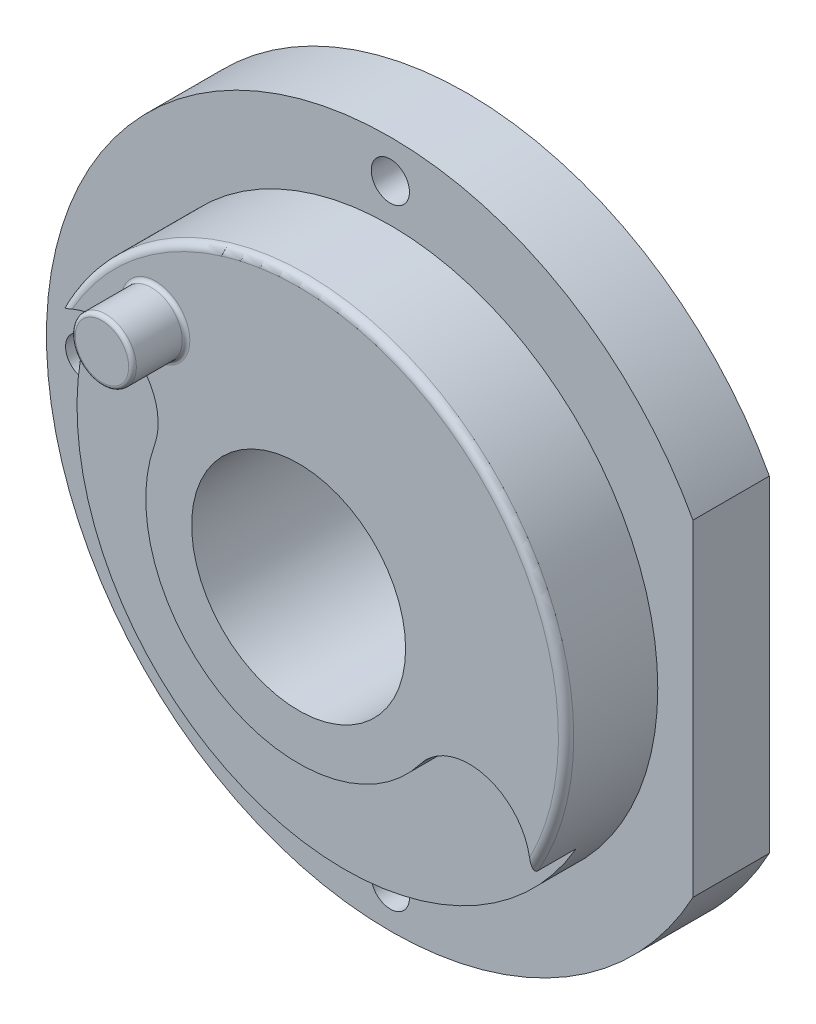
ISO-10303-21;
HEADER;
FILE_DESCRIPTION(('STEP AP214'),'2;1');
FILE_NAME('part.step','',(''),(''),'','','');
FILE_SCHEMA(('AUTOMOTIVE_DESIGN { 1 0 10303 214 1 1 1 1 }'));
ENDSEC;
DATA;
#1=APPLICATION_CONTEXT('core data for automotive mechanical design processes');
#2=APPLICATION_PROTOCOL_DEFINITION('international standard','automotive_design',2000,#1);
#3=PRODUCT_CONTEXT('',#1,'mechanical');
#4=PRODUCT('Part','Part','',(#3));
#5=PRODUCT_RELATED_PRODUCT_CATEGORY('part','',(#4));
#6=PRODUCT_DEFINITION_FORMATION('','',#4);
#7=PRODUCT_DEFINITION_CONTEXT('part definition',#1,'design');
#8=PRODUCT_DEFINITION('design','',#6,#7);
#9=PRODUCT_DEFINITION_SHAPE('','',#8);
#10=(LENGTH_UNIT() NAMED_UNIT(*) SI_UNIT(.MILLI.,.METRE.));
#11=(NAMED_UNIT(*) PLANE_ANGLE_UNIT() SI_UNIT($,.RADIAN.));
#12=(NAMED_UNIT(*) SI_UNIT($,.STERADIAN.) SOLID_ANGLE_UNIT());
#13=UNCERTAINTY_MEASURE_WITH_UNIT(LENGTH_MEASURE(1.E-05),#10,'distance_accuracy_value','');
#14=(GEOMETRIC_REPRESENTATION_CONTEXT(3) GLOBAL_UNCERTAINTY_ASSIGNED_CONTEXT((#13)) GLOBAL_UNIT_ASSIGNED_CONTEXT((#10,
#11,#12)) REPRESENTATION_CONTEXT('',''));
#15=CARTESIAN_POINT('',(0.,0.,0.));
#16=DIRECTION('',(0.,0.,1.));
#17=DIRECTION('',(1.,0.,0.));
#18=AXIS2_PLACEMENT_3D('',#15,#16,#17);
#19=CARTESIAN_POINT('',(0.,0.,5.));
#20=DIRECTION('',(0.,0.,1.));
#21=DIRECTION('',(1.,0.,0.));
#22=AXIS2_PLACEMENT_3D('',#19,#20,#21);
#23=PLANE('',#22);
#24=DIRECTION('',(0.,-1.,0.));
#25=VECTOR('',#24,1.);
#26=CARTESIAN_POINT('',(19.8,-17.9414071691897,5.));
#27=LINE('',#26,#25);
#28=CARTESIAN_POINT('',(19.8,10.6869078783341,5.));
#29=VERTEX_POINT('',#28);
#30=CARTESIAN_POINT('',(19.8,-10.6869078783341,5.));
#31=VERTEX_POINT('',#30);
#32=EDGE_CURVE('E58',#29,#31,#27,.T.);
#33=ORIENTED_EDGE('',*,*,#32,.F.);
#34=CARTESIAN_POINT('',(0.,0.,5.));
#35=DIRECTION('',(0.,0.,1.));
#36=DIRECTION('',(1.,0.,0.));
#37=AXIS2_PLACEMENT_3D('',#34,#35,#36);
#38=CIRCLE('',#37,22.5);
#39=EDGE_CURVE('E110',#29,#31,#38,.T.);
#40=ORIENTED_EDGE('',*,*,#39,.T.);
#41=EDGE_LOOP('',(#33,#40));
#42=FACE_BOUND('',#41,.T.);
#43=CARTESIAN_POINT('',(0.,0.,5.));
#44=DIRECTION('',(0.,0.,1.));
#45=DIRECTION('',(1.,0.,0.));
#46=AXIS2_PLACEMENT_3D('',#43,#44,#45);
#47=CIRCLE('',#46,17.5);
#48=CARTESIAN_POINT('',(17.5,0.,5.));
#49=VERTEX_POINT('',#48);
#50=EDGE_CURVE('E371',#49,#49,#47,.T.);
#51=ORIENTED_EDGE('',*,*,#50,.F.);
#52=EDGE_LOOP('',(#51));
#53=FACE_BOUND('',#52,.T.);
#54=CARTESIAN_POINT('',(0.,-20.,5.));
#55=DIRECTION('',(0.,0.,1.));
#56=DIRECTION('',(1.,0.,0.));
#57=AXIS2_PLACEMENT_3D('',#54,#55,#56);
#58=CIRCLE('',#57,1.25);
#59=CARTESIAN_POINT('',(1.25,-20.,5.));
#60=VERTEX_POINT('',#59);
#61=EDGE_CURVE('E381',#60,#60,#58,.T.);
#62=ORIENTED_EDGE('',*,*,#61,.F.);
#63=EDGE_LOOP('',(#62));
#64=FACE_BOUND('',#63,.T.);
#65=CARTESIAN_POINT('',(0.,20.,5.));
#66=DIRECTION('',(0.,0.,1.));
#67=DIRECTION('',(1.,0.,0.));
#68=AXIS2_PLACEMENT_3D('',#65,#66,#67);
#69=CIRCLE('',#68,1.25);
#70=CARTESIAN_POINT('',(1.25,20.,5.));
#71=VERTEX_POINT('',#70);
#72=EDGE_CURVE('E119',#71,#71,#69,.T.);
#73=ORIENTED_EDGE('',*,*,#72,.F.);
#74=EDGE_LOOP('',(#73));
#75=FACE_BOUND('',#74,.T.);
#76=CARTESIAN_POINT('',(-20.,0.,5.));
#77=DIRECTION('',(0.,0.,1.));
#78=DIRECTION('',(1.,0.,0.));
#79=AXIS2_PLACEMENT_3D('',#76,#77,#78);
#80=CIRCLE('',#79,1.25);
#81=CARTESIAN_POINT('',(-18.75,0.,5.));
#82=VERTEX_POINT('',#81);
#83=EDGE_CURVE('E375',#82,#82,#80,.T.);
#84=ORIENTED_EDGE('',*,*,#83,.F.);
#85=EDGE_LOOP('',(#84));
#86=FACE_BOUND('',#85,.T.);
#87=ADVANCED_FACE('F43',(#42,#53,#64,#75,#86),#23,.T.);
#88=CARTESIAN_POINT('',(0.,0.,0.));
#89=DIRECTION('',(0.,0.,1.));
#90=DIRECTION('',(1.,0.,0.));
#91=AXIS2_PLACEMENT_3D('',#88,#89,#90);
#92=PLANE('',#91);
#93=CARTESIAN_POINT('',(0.,0.,0.));
#94=DIRECTION('',(0.,0.,1.));
#95=DIRECTION('',(1.,0.,0.));
#96=AXIS2_PLACEMENT_3D('',#93,#94,#95);
#97=CIRCLE('',#96,7.);
#98=CARTESIAN_POINT('',(7.,0.,0.));
#99=VERTEX_POINT('',#98);
#100=EDGE_CURVE('E359',#99,#99,#97,.T.);
#101=ORIENTED_EDGE('',*,*,#100,.T.);
#102=EDGE_LOOP('',(#101));
#103=FACE_BOUND('',#102,.T.);
#104=CARTESIAN_POINT('',(0.,0.,0.));
#105=DIRECTION('',(0.,0.,1.));
#106=DIRECTION('',(1.,0.,0.));
#107=AXIS2_PLACEMENT_3D('',#104,#105,#106);
#108=CIRCLE('',#107,22.5);
#109=CARTESIAN_POINT('',(19.8,10.6869078783341,0.));
#110=VERTEX_POINT('',#109);
#111=CARTESIAN_POINT('',(19.8,-10.6869078783341,0.));
#112=VERTEX_POINT('',#111);
#113=EDGE_CURVE('E114',#110,#112,#108,.T.);
#114=ORIENTED_EDGE('',*,*,#113,.F.);
#115=DIRECTION('',(0.,-1.,0.));
#116=VECTOR('',#115,1.);
#117=CARTESIAN_POINT('',(19.8,0.,0.));
#118=LINE('',#117,#116);
#119=EDGE_CURVE('E102',#110,#112,#118,.T.);
#120=ORIENTED_EDGE('',*,*,#119,.T.);
#121=EDGE_LOOP('',(#114,#120));
#122=FACE_BOUND('',#121,.T.);
#123=CARTESIAN_POINT('',(0.,20.,0.));
#124=DIRECTION('',(0.,0.,1.));
#125=DIRECTION('',(1.,0.,0.));
#126=AXIS2_PLACEMENT_3D('',#123,#124,#125);
#127=CIRCLE('',#126,1.25);
#128=CARTESIAN_POINT('',(1.25,20.,0.));
#129=VERTEX_POINT('',#128);
#130=EDGE_CURVE('E122',#129,#129,#127,.T.);
#131=ORIENTED_EDGE('',*,*,#130,.T.);
#132=EDGE_LOOP('',(#131));
#133=FACE_BOUND('',#132,.T.);
#134=CARTESIAN_POINT('',(0.,-20.,0.));
#135=DIRECTION('',(0.,0.,1.));
#136=DIRECTION('',(1.,0.,0.));
#137=AXIS2_PLACEMENT_3D('',#134,#135,#136);
#138=CIRCLE('',#137,1.25);
#139=CARTESIAN_POINT('',(1.25,-20.,0.));
#140=VERTEX_POINT('',#139);
#141=EDGE_CURVE('E378',#140,#140,#138,.T.);
#142=ORIENTED_EDGE('',*,*,#141,.T.);
#143=EDGE_LOOP('',(#142));
#144=FACE_BOUND('',#143,.T.);
#145=CARTESIAN_POINT('',(-20.,0.,0.));
#146=DIRECTION('',(0.,0.,1.));
#147=DIRECTION('',(1.,0.,0.));
#148=AXIS2_PLACEMENT_3D('',#145,#146,#147);
#149=CIRCLE('',#148,1.25);
#150=CARTESIAN_POINT('',(-18.75,0.,0.));
#151=VERTEX_POINT('',#150);
#152=EDGE_CURVE('E374',#151,#151,#149,.T.);
#153=ORIENTED_EDGE('',*,*,#152,.T.);
#154=EDGE_LOOP('',(#153));
#155=FACE_BOUND('',#154,.T.);
#156=ADVANCED_FACE('F199',(#103,#122,#133,#144,#155),#92,.F.);
#157=CARTESIAN_POINT('',(0.,0.,5.));
#158=DIRECTION('',(0.,0.,-1.));
#159=DIRECTION('',(-1.,0.,0.));
#160=AXIS2_PLACEMENT_3D('',#157,#158,#159);
#161=CYLINDRICAL_SURFACE('',#160,22.5);
#162=ORIENTED_EDGE('',*,*,#39,.F.);
#163=DIRECTION('',(0.,0.,-1.));
#164=VECTOR('',#163,1.);
#165=CARTESIAN_POINT('',(19.8,10.6869078783341,5.));
#166=LINE('',#165,#164);
#167=EDGE_CURVE('E11',#29,#110,#166,.T.);
#168=ORIENTED_EDGE('',*,*,#167,.T.);
#169=ORIENTED_EDGE('',*,*,#113,.T.);
#170=DIRECTION('',(0.,0.,-1.));
#171=VECTOR('',#170,1.);
#172=CARTESIAN_POINT('',(19.8,-10.6869078783341,5.));
#173=LINE('',#172,#171);
#174=EDGE_CURVE('E51',#112,#31,#173,.F.);
#175=ORIENTED_EDGE('',*,*,#174,.T.);
#176=EDGE_LOOP('',(#162,#168,#169,#175));
#177=FACE_BOUND('',#176,.T.);
#178=ADVANCED_FACE('F112',(#177),#161,.T.);
#179=CARTESIAN_POINT('',(0.,20.,5.));
#180=DIRECTION('',(0.,0.,-1.));
#181=DIRECTION('',(-1.,0.,0.));
#182=AXIS2_PLACEMENT_3D('',#179,#180,#181);
#183=CYLINDRICAL_SURFACE('',#182,1.25);
#184=ORIENTED_EDGE('',*,*,#72,.T.);
#185=EDGE_LOOP('',(#184));
#186=FACE_BOUND('',#185,.T.);
#187=ORIENTED_EDGE('',*,*,#130,.F.);
#188=EDGE_LOOP('',(#187));
#189=FACE_BOUND('',#188,.T.);
#190=ADVANCED_FACE('F192',(#186,#189),#183,.F.);
#191=CARTESIAN_POINT('',(0.,-20.,5.));
#192=DIRECTION('',(0.,0.,-1.));
#193=DIRECTION('',(-1.,0.,0.));
#194=AXIS2_PLACEMENT_3D('',#191,#192,#193);
#195=CYLINDRICAL_SURFACE('',#194,1.25);
#196=ORIENTED_EDGE('',*,*,#61,.T.);
#197=EDGE_LOOP('',(#196));
#198=FACE_BOUND('',#197,.T.);
#199=ORIENTED_EDGE('',*,*,#141,.F.);
#200=EDGE_LOOP('',(#199));
#201=FACE_BOUND('',#200,.T.);
#202=ADVANCED_FACE('F188',(#198,#201),#195,.F.);
#203=CARTESIAN_POINT('',(-20.,0.,5.));
#204=DIRECTION('',(0.,0.,-1.));
#205=DIRECTION('',(-1.,0.,0.));
#206=AXIS2_PLACEMENT_3D('',#203,#204,#205);
#207=CYLINDRICAL_SURFACE('',#206,1.25);
#208=ORIENTED_EDGE('',*,*,#83,.T.);
#209=EDGE_LOOP('',(#208));
#210=FACE_BOUND('',#209,.T.);
#211=ORIENTED_EDGE('',*,*,#152,.F.);
#212=EDGE_LOOP('',(#211));
#213=FACE_BOUND('',#212,.T.);
#214=ADVANCED_FACE('F184',(#210,#213),#207,.F.);
#215=CARTESIAN_POINT('',(0.,0.,11.));
#216=DIRECTION('',(0.,0.,-1.));
#217=DIRECTION('',(-1.,0.,0.));
#218=AXIS2_PLACEMENT_3D('',#215,#216,#217);
#219=CYLINDRICAL_SURFACE('',#218,17.5);
#220=CARTESIAN_POINT('',(0.,0.,8.));
#221=DIRECTION('',(0.,0.,1.));
#222=DIRECTION('',(1.,0.,0.));
#223=AXIS2_PLACEMENT_3D('',#220,#221,#222);
#224=CIRCLE('',#223,17.5);
#225=CARTESIAN_POINT('',(-15.6420504470762,7.84705408488593,8.));
#226=VERTEX_POINT('',#225);
#227=CARTESIAN_POINT('',(15.1549923195811,-8.75078326742467,8.));
#228=VERTEX_POINT('',#227);
#229=EDGE_CURVE('E344',#226,#228,#224,.T.);
#230=ORIENTED_EDGE('',*,*,#229,.F.);
#231=DIRECTION('',(0.,0.,1.));
#232=VECTOR('',#231,1.);
#233=CARTESIAN_POINT('',(-15.6420504470762,7.84705408488592,9.5));
#234=LINE('',#233,#232);
#235=CARTESIAN_POINT('',(-15.6420504470762,7.84705408488594,10.5000000000009));
#236=VERTEX_POINT('',#235);
#237=EDGE_CURVE('E369',#226,#236,#234,.T.);
#238=ORIENTED_EDGE('',*,*,#237,.T.);
#239=CARTESIAN_POINT('',(0.,0.,10.5));
#240=DIRECTION('',(0.,0.,1.));
#241=DIRECTION('',(1.,0.,0.));
#242=AXIS2_PLACEMENT_3D('',#239,#240,#241);
#243=CIRCLE('',#242,17.5);
#244=CARTESIAN_POINT('',(15.1549923195811,-8.75078326742466,10.5));
#245=VERTEX_POINT('',#244);
#246=EDGE_CURVE('E117',#236,#245,#243,.F.);
#247=ORIENTED_EDGE('',*,*,#246,.T.);
#248=DIRECTION('',(0.,0.,1.));
#249=VECTOR('',#248,1.);
#250=CARTESIAN_POINT('',(15.1549923195811,-8.75078326742468,9.5));
#251=LINE('',#250,#249);
#252=EDGE_CURVE('E66',#245,#228,#251,.F.);
#253=ORIENTED_EDGE('',*,*,#252,.T.);
#254=EDGE_LOOP('',(#230,#238,#247,#253));
#255=FACE_BOUND('',#254,.T.);
#256=ORIENTED_EDGE('',*,*,#50,.T.);
#257=EDGE_LOOP('',(#256));
#258=FACE_BOUND('',#257,.T.);
#259=ADVANCED_FACE('F180',(#255,#258),#219,.T.);
#260=CARTESIAN_POINT('',(0.,0.,11.));
#261=DIRECTION('',(0.,0.,1.));
#262=DIRECTION('',(1.,0.,0.));
#263=AXIS2_PLACEMENT_3D('',#260,#261,#262);
#264=PLANE('',#263);
#265=CARTESIAN_POINT('',(0.,0.,11.));
#266=DIRECTION('',(0.,0.,1.));
#267=DIRECTION('',(1.,0.,0.));
#268=AXIS2_PLACEMENT_3D('',#265,#266,#267);
#269=CIRCLE('',#268,7.);
#270=CARTESIAN_POINT('',(7.,0.,11.));
#271=VERTEX_POINT('',#270);
#272=EDGE_CURVE('E413',#271,#271,#269,.T.);
#273=ORIENTED_EDGE('',*,*,#272,.F.);
#274=EDGE_LOOP('',(#273));
#275=FACE_BOUND('',#274,.T.);
#276=CARTESIAN_POINT('',(-13.1930422619878,4.68440347039018,11.));
#277=DIRECTION('',(0.,0.,1.));
#278=DIRECTION('',(1.,0.,0.));
#279=AXIS2_PLACEMENT_3D('',#276,#277,#278);
#280=CIRCLE('',#279,4.);
#281=CARTESIAN_POINT('',(-9.42360161570558,3.34600247885013,11.));
#282=VERTEX_POINT('',#281);
#283=CARTESIAN_POINT('',(-14.8126068155352,8.34186306099305,11.));
#284=VERTEX_POINT('',#283);
#285=EDGE_CURVE('E350',#282,#284,#280,.T.);
#286=ORIENTED_EDGE('',*,*,#285,.F.);
#287=CARTESIAN_POINT('',(0.,0.,11.));
#288=DIRECTION('',(0.,0.,-1.));
#289=DIRECTION('',(1.,0.,0.));
#290=AXIS2_PLACEMENT_3D('',#287,#288,#289);
#291=CIRCLE('',#290,10.);
#292=CARTESIAN_POINT('',(7.97625995299374,-6.03152361864466,11.));
#293=VERTEX_POINT('',#292);
#294=EDGE_CURVE('E353',#293,#282,#291,.T.);
#295=ORIENTED_EDGE('',*,*,#294,.F.);
#296=CARTESIAN_POINT('',(11.1667639341912,-8.44413306610253,11.));
#297=DIRECTION('',(0.,0.,1.));
#298=DIRECTION('',(1.,0.,0.));
#299=AXIS2_PLACEMENT_3D('',#296,#297,#298);
#300=CIRCLE('',#299,4.);
#301=CARTESIAN_POINT('',(15.1122347108096,-7.78590791400737,11.));
#302=VERTEX_POINT('',#301);
#303=EDGE_CURVE('E351',#302,#293,#300,.T.);
#304=ORIENTED_EDGE('',*,*,#303,.F.);
#305=CARTESIAN_POINT('',(0.,0.,11.));
#306=DIRECTION('',(0.,0.,1.));
#307=DIRECTION('',(1.,0.,0.));
#308=AXIS2_PLACEMENT_3D('',#305,#306,#307);
#309=CIRCLE('',#308,17.);
#310=EDGE_CURVE('E113',#302,#284,#309,.T.);
#311=ORIENTED_EDGE('',*,*,#310,.T.);
#312=EDGE_LOOP('',(#286,#295,#304,#311));
#313=FACE_BOUND('',#312,.T.);
#314=CARTESIAN_POINT('',(-9.367828489024,10.4040275566835,11.));
#315=DIRECTION('',(0.,0.,1.));
#316=DIRECTION('',(1.,0.,0.));
#317=AXIS2_PLACEMENT_3D('',#314,#315,#316);
#318=CIRCLE('',#317,2.25);
#319=CARTESIAN_POINT('',(-7.117828489024,10.4040275566835,11.));
#320=VERTEX_POINT('',#319);
#321=EDGE_CURVE('E133',#320,#320,#318,.F.);
#322=ORIENTED_EDGE('',*,*,#321,.T.);
#323=EDGE_LOOP('',(#322));
#324=FACE_BOUND('',#323,.T.);
#325=ADVANCED_FACE('F176',(#275,#313,#324),#264,.T.);
#326=CARTESIAN_POINT('',(-9.367828489024,10.4040275566835,14.5));
#327=DIRECTION('',(0.,0.,-1.));
#328=DIRECTION('',(-1.,0.,0.));
#329=AXIS2_PLACEMENT_3D('',#326,#327,#328);
#330=CYLINDRICAL_SURFACE('',#329,2.);
#331=CARTESIAN_POINT('',(-9.367828489024,10.4040275566835,11.25));
#332=DIRECTION('',(0.,0.,1.));
#333=DIRECTION('',(1.,0.,0.));
#334=AXIS2_PLACEMENT_3D('',#331,#332,#333);
#335=CIRCLE('',#334,2.);
#336=CARTESIAN_POINT('',(-7.367828489024,10.4040275566835,11.25));
#337=VERTEX_POINT('',#336);
#338=EDGE_CURVE('E130',#337,#337,#335,.T.);
#339=ORIENTED_EDGE('',*,*,#338,.T.);
#340=EDGE_LOOP('',(#339));
#341=FACE_BOUND('',#340,.T.);
#342=CARTESIAN_POINT('',(-9.367828489024,10.4040275566835,14.25));
#343=DIRECTION('',(0.,0.,1.));
#344=DIRECTION('',(1.,0.,0.));
#345=AXIS2_PLACEMENT_3D('',#342,#343,#344);
#346=CIRCLE('',#345,2.);
#347=CARTESIAN_POINT('',(-7.367828489024,10.4040275566835,14.25));
#348=VERTEX_POINT('',#347);
#349=EDGE_CURVE('E127',#348,#348,#346,.F.);
#350=ORIENTED_EDGE('',*,*,#349,.T.);
#351=EDGE_LOOP('',(#350));
#352=FACE_BOUND('',#351,.T.);
#353=ADVANCED_FACE('F172',(#341,#352),#330,.T.);
#354=CARTESIAN_POINT('',(-9.367828489024,10.4040275566835,14.5));
#355=DIRECTION('',(0.,0.,1.));
#356=DIRECTION('',(1.,0.,0.));
#357=AXIS2_PLACEMENT_3D('',#354,#355,#356);
#358=PLANE('',#357);
#359=CARTESIAN_POINT('',(-9.367828489024,10.4040275566835,14.5));
#360=DIRECTION('',(0.,0.,1.));
#361=DIRECTION('',(1.,0.,0.));
#362=AXIS2_PLACEMENT_3D('',#359,#360,#361);
#363=CIRCLE('',#362,1.75);
#364=CARTESIAN_POINT('',(-7.617828489024,10.4040275566835,14.5));
#365=VERTEX_POINT('',#364);
#366=EDGE_CURVE('E136',#365,#365,#363,.T.);
#367=ORIENTED_EDGE('',*,*,#366,.T.);
#368=EDGE_LOOP('',(#367));
#369=FACE_BOUND('',#368,.T.);
#370=ADVANCED_FACE('F169',(#369),#358,.T.);
#371=CARTESIAN_POINT('',(0.,0.,10.5));
#372=DIRECTION('',(0.,0.,1.));
#373=DIRECTION('',(1.,0.,0.));
#374=AXIS2_PLACEMENT_3D('',#371,#372,#373);
#375=TOROIDAL_SURFACE('',#374,17.,0.5);
#376=CARTESIAN_POINT('',(-14.0925554842546,8.58195089960348,10.4998));
#377=CARTESIAN_POINT('',(-14.0924954054147,8.58195890672162,10.5221016836643));
#378=CARTESIAN_POINT('',(-14.0945603759896,8.58148831247698,10.5443581106371));
#379=CARTESIAN_POINT('',(-14.1025345979372,8.57963798600353,10.5879636089799));
#380=CARTESIAN_POINT('',(-14.1084143740486,8.57826522337488,10.6093183111679));
#381=CARTESIAN_POINT('',(-14.1236070048994,8.57466126596326,10.65062005845));
#382=CARTESIAN_POINT('',(-14.1329125698104,8.57243189354615,10.6705699861917));
#383=CARTESIAN_POINT('',(-14.1544039544479,8.56717403516507,10.7087613957006));
#384=CARTESIAN_POINT('',(-14.1665951669323,8.56414405175444,10.7269995883281));
#385=CARTESIAN_POINT('',(-14.1980966929068,8.55612312486784,10.7677610060254));
#386=CARTESIAN_POINT('',(-14.2183897756552,8.55081893838281,10.789462501406));
#387=CARTESIAN_POINT('',(-14.2619723270169,8.53899839198793,10.8292055885751));
#388=CARTESIAN_POINT('',(-14.2852671054368,8.53247987467245,10.84724054516));
#389=CARTESIAN_POINT('',(-14.3438891877824,8.51543719811897,10.8865601989914));
#390=CARTESIAN_POINT('',(-14.3802149681455,8.50437010499717,10.9061147312752));
#391=CARTESIAN_POINT('',(-14.4549126003551,8.48035360309176,10.9391078917499));
#392=CARTESIAN_POINT('',(-14.4932873237058,8.46740150625872,10.9525376709444));
#393=CARTESIAN_POINT('',(-14.5894570539597,8.4332311650458,10.9792923134893));
#394=CARTESIAN_POINT('',(-14.6477652323556,8.41102145761363,10.9894972527948));
#395=CARTESIAN_POINT('',(-14.7640559652629,8.36352095122454,11.0005304652116));
#396=CARTESIAN_POINT('',(-14.8220369149504,8.3382206648887,11.0013290931301));
#397=CARTESIAN_POINT('',(-14.9536990871508,8.27700679749828,10.9939416701968));
#398=CARTESIAN_POINT('',(-15.0268241308473,8.24019780297734,10.9829647273049));
#399=CARTESIAN_POINT('',(-15.1328059834076,8.18282359179748,10.9573275750585));
#400=CARTESIAN_POINT('',(-15.1674755331101,8.16336383011166,10.947271101555));
#401=CARTESIAN_POINT('',(-15.2354265017855,8.12390949394304,10.9240302343841));
#402=CARTESIAN_POINT('',(-15.2687089646543,8.10391534093849,10.910848244795));
#403=CARTESIAN_POINT('',(-15.326023590079,8.06837302024599,10.8845785538095));
#404=CARTESIAN_POINT('',(-15.3504051067503,8.05287369551752,10.8721836446353));
#405=CARTESIAN_POINT('',(-15.3980402894818,8.02188639300569,10.8451255616875));
#406=CARTESIAN_POINT('',(-15.4212900507165,8.0063986142266,10.830455177971));
#407=CARTESIAN_POINT('',(-15.4719889025704,7.97188987430223,10.7944163417475));
#408=CARTESIAN_POINT('',(-15.4989855173005,7.95298159901716,10.7722950267687));
#409=CARTESIAN_POINT('',(-15.5490840398269,7.91704798570156,10.7226857159664));
#410=CARTESIAN_POINT('',(-15.5722105119845,7.90001102765007,10.6952341602495));
#411=CARTESIAN_POINT('',(-15.5991699213199,7.8798133603306,10.6522370126428));
#412=CARTESIAN_POINT('',(-15.6061467488276,7.87454292602374,10.6396912902777));
#413=CARTESIAN_POINT('',(-15.6185725441243,7.86510490048936,10.6135321935004));
#414=CARTESIAN_POINT('',(-15.6240285725322,7.86093221797937,10.5999241415989));
#415=CARTESIAN_POINT('',(-15.6328005738064,7.85420016935077,10.5722619055272));
#416=CARTESIAN_POINT('',(-15.636193768152,7.85158268482115,10.5582476546413));
#417=CARTESIAN_POINT('',(-15.6408615552638,7.84797496104798,10.5294536697967));
#418=CARTESIAN_POINT('',(-15.6421026110678,7.84701048339867,10.5146654551682));
#419=CARTESIAN_POINT('',(-15.6420503738977,7.84705414155187,10.4998));
#420=B_SPLINE_CURVE_WITH_KNOTS('',3,(#376,#377,#378,#379,#380,#381,#382,#383,#384,#385,#386,
#387,#388,#389,#390,#391,#392,#393,#394,#395,#396,#397,#398,#399,#400,#401,#402,#403,#404,#405,
#406,#407,#408,#409,#410,#411,#412,#413,#414,#415,#416,#417,#418,#419),.UNSPECIFIED.,.F.,.F.,(4,
2,2,2,2,2,2,2,2,2,2,2,2,2,2,2,2,2,2,2,2,4),(0.,0.0667299356915614,0.132950322840486,
0.199030604741618,0.265235367670183,0.355278870585104,0.445483899295609,0.572913410305842,
0.700526451736312,0.889151190584204,1.07837024591992,1.32482701157969,1.44775530274643,
1.57058934516832,1.66482084436369,1.75935726094649,1.87814165392613,1.99614088585408,
2.04190009722883,2.08744318260136,2.13115521090478,2.17554248395824),.UNSPECIFIED.);
#421=EDGE_CURVE('E147',#284,#236,#420,.T.);
#422=ORIENTED_EDGE('',*,*,#421,.F.);
#423=ORIENTED_EDGE('',*,*,#310,.F.);
#424=CARTESIAN_POINT('',(15.1549923266764,-8.75078317514375,10.4998));
#425=CARTESIAN_POINT('',(15.1549864480263,-8.75083501748741,10.5133418363376));
#426=CARTESIAN_POINT('',(15.1550879583852,-8.7495407208026,10.5268307305674));
#427=CARTESIAN_POINT('',(15.1554618273514,-8.74463073573373,10.5532035186283));
#428=CARTESIAN_POINT('',(15.1557319505222,-8.74104540690169,10.5660929938129));
#429=CARTESIAN_POINT('',(15.1564919222999,-8.73066793294204,10.5945341956772));
#430=CARTESIAN_POINT('',(15.157021505383,-8.72326958529509,10.6098591804471));
#431=CARTESIAN_POINT('',(15.1581844734355,-8.70611996400087,10.6391910184899));
#432=CARTESIAN_POINT('',(15.1588184345381,-8.6963554803261,10.653189835018));
#433=CARTESIAN_POINT('',(15.1605366922394,-8.6679481599043,10.6889623904212));
#434=CARTESIAN_POINT('',(15.161633013222,-8.64779448939199,10.7095210525954));
#435=CARTESIAN_POINT('',(15.1635940988126,-8.60481107511498,10.7475650701757));
#436=CARTESIAN_POINT('',(15.1644583701314,-8.58197577649029,10.7650438517271));
#437=CARTESIAN_POINT('',(15.1658045729666,-8.5348252383894,10.7973735030004));
#438=CARTESIAN_POINT('',(15.1662898648533,-8.51052511299204,10.8122465407668));
#439=CARTESIAN_POINT('',(15.1668070632969,-8.46077634401864,10.8399532017657));
#440=CARTESIAN_POINT('',(15.1668385560817,-8.43532667349488,10.8527849532232));
#441=CARTESIAN_POINT('',(15.1661632557306,-8.3576584864415,10.8886664971283));
#442=CARTESIAN_POINT('',(15.164684043812,-8.30420056694496,10.9090515558003));
#443=CARTESIAN_POINT('',(15.160139222337,-8.21067496654829,10.9388633549337));
#444=CARTESIAN_POINT('',(15.1576305305356,-8.17102697114561,10.9497608138761));
#445=CARTESIAN_POINT('',(15.1513558155265,-8.09109055663689,10.968450173384));
#446=CARTESIAN_POINT('',(15.1475891498228,-8.05080182031427,10.9762404825375));
#447=CARTESIAN_POINT('',(15.1343496604379,-7.92951732979092,10.994866059324));
#448=CARTESIAN_POINT('',(15.1229284521873,-7.84790824380169,11.0010174198631));
#449=CARTESIAN_POINT('',(15.0996364101552,-7.71228036031739,10.999090269974));
#450=CARTESIAN_POINT('',(15.0891280731723,-7.65794709267788,10.9949996957675));
#451=CARTESIAN_POINT('',(15.0661257503245,-7.55085389161759,10.9790034078933));
#452=CARTESIAN_POINT('',(15.0536355338713,-7.49809119287024,10.96711239825));
#453=CARTESIAN_POINT('',(15.0313231773708,-7.41139621161847,10.9389699528399));
#454=CARTESIAN_POINT('',(15.0218375762686,-7.37659771766759,10.9251272999208));
#455=CARTESIAN_POINT('',(15.0026502185918,-7.30959315835768,10.8922200643913));
#456=CARTESIAN_POINT('',(14.9929487630466,-7.27738374016586,10.8731623808895));
#457=CARTESIAN_POINT('',(14.9764913968171,-7.22490073716813,10.8349925563384));
#458=CARTESIAN_POINT('',(14.9696283033717,-7.20370772307823,10.8171963080476));
#459=CARTESIAN_POINT('',(14.9565594201267,-7.16433692457174,10.7783077558484));
#460=CARTESIAN_POINT('',(14.9503528194063,-7.1461554041637,10.7572195998934));
#461=CARTESIAN_POINT('',(14.9401951578673,-7.11695221224745,10.7162862871452));
#462=CARTESIAN_POINT('',(14.9360401800262,-7.10522576817385,10.6969966201085));
#463=CARTESIAN_POINT('',(14.928781137479,-7.08496345924183,10.6566447124028));
#464=CARTESIAN_POINT('',(14.9256750046707,-7.07642131211723,10.6355860634582));
#465=CARTESIAN_POINT('',(14.9211613060392,-7.0640827145273,10.5955499008301));
#466=CARTESIAN_POINT('',(14.9195647877745,-7.05975505242317,10.5767575616912));
#467=CARTESIAN_POINT('',(14.9174049166409,-7.05391912037764,10.5385874316666));
#468=CARTESIAN_POINT('',(14.916846868013,-7.05242532435935,10.5192071461784));
#469=CARTESIAN_POINT('',(14.9168633402617,-7.05245981257291,10.4998));
#470=B_SPLINE_CURVE_WITH_KNOTS('',3,(#424,#425,#426,#427,#428,#429,#430,#431,#432,#433,#434,
#435,#436,#437,#438,#439,#440,#441,#442,#443,#444,#445,#446,#447,#448,#449,#450,#451,#452,#453,
#454,#455,#456,#457,#458,#459,#460,#461,#462,#463,#464,#465,#466,#467,#468,#469),.UNSPECIFIED.,
.F.,.F.,(4,2,2,2,2,2,2,2,2,2,2,2,2,2,2,2,2,2,2,2,2,2,4),(0.,0.040475002383402,
0.0804244703897522,0.131214975111177,0.182295852681719,0.268242696443802,0.35437082407878,
0.439726306714338,0.525159611181467,0.696307674425138,0.819764376615235,0.943284229597168,
1.18971664707349,1.35574600481353,1.52146328875513,1.63702740089945,1.752439363078,
1.83768901219982,1.92283209729037,1.9914211795014,2.05987421772565,2.1176891281305,
2.1757985404537),.UNSPECIFIED.);
#471=EDGE_CURVE('E139',#245,#302,#470,.T.);
#472=ORIENTED_EDGE('',*,*,#471,.F.);
#473=ORIENTED_EDGE('',*,*,#246,.F.);
#474=EDGE_LOOP('',(#422,#423,#472,#473));
#475=FACE_BOUND('',#474,.T.);
#476=ADVANCED_FACE('F154',(#475),#375,.T.);
#477=CARTESIAN_POINT('',(-9.367828489024,10.4040275566835,11.25));
#478=DIRECTION('',(0.,0.,1.));
#479=DIRECTION('',(1.,0.,0.));
#480=AXIS2_PLACEMENT_3D('',#477,#478,#479);
#481=TOROIDAL_SURFACE('',#480,2.25,0.25);
#482=ORIENTED_EDGE('',*,*,#321,.F.);
#483=EDGE_LOOP('',(#482));
#484=FACE_BOUND('',#483,.T.);
#485=ORIENTED_EDGE('',*,*,#338,.F.);
#486=EDGE_LOOP('',(#485));
#487=FACE_BOUND('',#486,.T.);
#488=ADVANCED_FACE('F264',(#484,#487),#481,.F.);
#489=CARTESIAN_POINT('',(-9.367828489024,10.4040275566835,14.25));
#490=DIRECTION('',(0.,0.,1.));
#491=DIRECTION('',(1.,0.,0.));
#492=AXIS2_PLACEMENT_3D('',#489,#490,#491);
#493=TOROIDAL_SURFACE('',#492,1.75,0.25);
#494=ORIENTED_EDGE('',*,*,#349,.F.);
#495=EDGE_LOOP('',(#494));
#496=FACE_BOUND('',#495,.T.);
#497=ORIENTED_EDGE('',*,*,#366,.F.);
#498=EDGE_LOOP('',(#497));
#499=FACE_BOUND('',#498,.T.);
#500=ADVANCED_FACE('F45',(#496,#499),#493,.T.);
#501=CARTESIAN_POINT('',(-6.59652113099391,2.34220173519509,8.));
#502=DIRECTION('',(0.,0.,1.));
#503=DIRECTION('',(1.,0.,0.));
#504=AXIS2_PLACEMENT_3D('',#501,#502,#503);
#505=PLANE('',#504);
#506=ORIENTED_EDGE('',*,*,#229,.T.);
#507=CARTESIAN_POINT('',(11.1667639341912,-8.44413306610253,8.));
#508=DIRECTION('',(0.,0.,1.));
#509=DIRECTION('',(1.,0.,0.));
#510=AXIS2_PLACEMENT_3D('',#507,#508,#509);
#511=CIRCLE('',#510,4.);
#512=CARTESIAN_POINT('',(7.97625995299374,-6.03152361864466,8.));
#513=VERTEX_POINT('',#512);
#514=EDGE_CURVE('E409',#228,#513,#511,.T.);
#515=ORIENTED_EDGE('',*,*,#514,.T.);
#516=CARTESIAN_POINT('',(0.,0.,8.));
#517=DIRECTION('',(0.,0.,-1.));
#518=DIRECTION('',(1.,0.,0.));
#519=AXIS2_PLACEMENT_3D('',#516,#517,#518);
#520=CIRCLE('',#519,10.);
#521=CARTESIAN_POINT('',(-9.42360161570558,3.34600247885013,8.));
#522=VERTEX_POINT('',#521);
#523=EDGE_CURVE('E367',#513,#522,#520,.T.);
#524=ORIENTED_EDGE('',*,*,#523,.T.);
#525=CARTESIAN_POINT('',(-13.1930422619878,4.68440347039018,8.));
#526=DIRECTION('',(0.,0.,1.));
#527=DIRECTION('',(1.,0.,0.));
#528=AXIS2_PLACEMENT_3D('',#525,#526,#527);
#529=CIRCLE('',#528,4.);
#530=EDGE_CURVE('E357',#522,#226,#529,.T.);
#531=ORIENTED_EDGE('',*,*,#530,.T.);
#532=EDGE_LOOP('',(#506,#515,#524,#531));
#533=FACE_BOUND('',#532,.T.);
#534=ADVANCED_FACE('F167',(#533),#505,.T.);
#535=CARTESIAN_POINT('',(-13.1930422619878,4.68440347039018,8.));
#536=DIRECTION('',(0.,0.,1.));
#537=DIRECTION('',(1.,0.,0.));
#538=AXIS2_PLACEMENT_3D('',#535,#536,#537);
#539=CYLINDRICAL_SURFACE('',#538,4.);
#540=ORIENTED_EDGE('',*,*,#530,.F.);
#541=DIRECTION('',(0.,0.,1.));
#542=VECTOR('',#541,1.);
#543=CARTESIAN_POINT('',(-9.42360161570558,3.34600247885013,8.));
#544=LINE('',#543,#542);
#545=EDGE_CURVE('E363',#522,#282,#544,.T.);
#546=ORIENTED_EDGE('',*,*,#545,.T.);
#547=ORIENTED_EDGE('',*,*,#285,.T.);
#548=ORIENTED_EDGE('',*,*,#421,.T.);
#549=ORIENTED_EDGE('',*,*,#237,.F.);
#550=EDGE_LOOP('',(#540,#546,#547,#548,#549));
#551=FACE_BOUND('',#550,.T.);
#552=ADVANCED_FACE('F162',(#551),#539,.F.);
#553=CARTESIAN_POINT('',(11.1667639341912,-8.44413306610253,8.));
#554=DIRECTION('',(0.,0.,1.));
#555=DIRECTION('',(1.,0.,0.));
#556=AXIS2_PLACEMENT_3D('',#553,#554,#555);
#557=CYLINDRICAL_SURFACE('',#556,4.);
#558=ORIENTED_EDGE('',*,*,#471,.T.);
#559=ORIENTED_EDGE('',*,*,#303,.T.);
#560=DIRECTION('',(0.,0.,1.));
#561=VECTOR('',#560,1.);
#562=CARTESIAN_POINT('',(7.97625995299374,-6.03152361864466,8.));
#563=LINE('',#562,#561);
#564=EDGE_CURVE('E365',#513,#293,#563,.T.);
#565=ORIENTED_EDGE('',*,*,#564,.F.);
#566=ORIENTED_EDGE('',*,*,#514,.F.);
#567=ORIENTED_EDGE('',*,*,#252,.F.);
#568=EDGE_LOOP('',(#558,#559,#565,#566,#567));
#569=FACE_BOUND('',#568,.T.);
#570=ADVANCED_FACE('F157',(#569),#557,.F.);
#571=CARTESIAN_POINT('',(0.,0.,8.));
#572=DIRECTION('',(0.,0.,1.));
#573=DIRECTION('',(1.,0.,0.));
#574=AXIS2_PLACEMENT_3D('',#571,#572,#573);
#575=CYLINDRICAL_SURFACE('',#574,10.);
#576=ORIENTED_EDGE('',*,*,#294,.T.);
#577=ORIENTED_EDGE('',*,*,#545,.F.);
#578=ORIENTED_EDGE('',*,*,#523,.F.);
#579=ORIENTED_EDGE('',*,*,#564,.T.);
#580=EDGE_LOOP('',(#576,#577,#578,#579));
#581=FACE_BOUND('',#580,.T.);
#582=ADVANCED_FACE('F161',(#581),#575,.T.);
#583=CARTESIAN_POINT('',(0.,0.,0.));
#584=DIRECTION('',(0.,0.,1.));
#585=DIRECTION('',(1.,0.,0.));
#586=AXIS2_PLACEMENT_3D('',#583,#584,#585);
#587=CYLINDRICAL_SURFACE('',#586,7.);
#588=ORIENTED_EDGE('',*,*,#100,.F.);
#589=EDGE_LOOP('',(#588));
#590=FACE_BOUND('',#589,.T.);
#591=ORIENTED_EDGE('',*,*,#272,.T.);
#592=EDGE_LOOP('',(#591));
#593=FACE_BOUND('',#592,.T.);
#594=ADVANCED_FACE('F214',(#590,#593),#587,.F.);
#595=CARTESIAN_POINT('',(19.8,-17.9414071691897,-12.));
#596=DIRECTION('',(-1.,0.,0.));
#597=DIRECTION('',(0.,0.,1.));
#598=AXIS2_PLACEMENT_3D('',#595,#596,#597);
#599=PLANE('',#598);
#600=ORIENTED_EDGE('',*,*,#32,.T.);
#601=ORIENTED_EDGE('',*,*,#174,.F.);
#602=ORIENTED_EDGE('',*,*,#119,.F.);
#603=ORIENTED_EDGE('',*,*,#167,.F.);
#604=EDGE_LOOP('',(#600,#601,#602,#603));
#605=FACE_BOUND('',#604,.T.);
#606=ADVANCED_FACE('F100',(#605),#599,.F.);
#607=CLOSED_SHELL('',(#87,#156,#178,#190,#202,#214,#259,#325,#353,#370,#476,#488,#500,#534,#552,
#570,#582,#594,#606));
#608=MANIFOLD_SOLID_BREP('B2',#607);
#609=ADVANCED_BREP_SHAPE_REPRESENTATION('',(#18,#608),#14);
#610=SHAPE_DEFINITION_REPRESENTATION(#9,#609);
ENDSEC;
END-ISO-10303-21;
